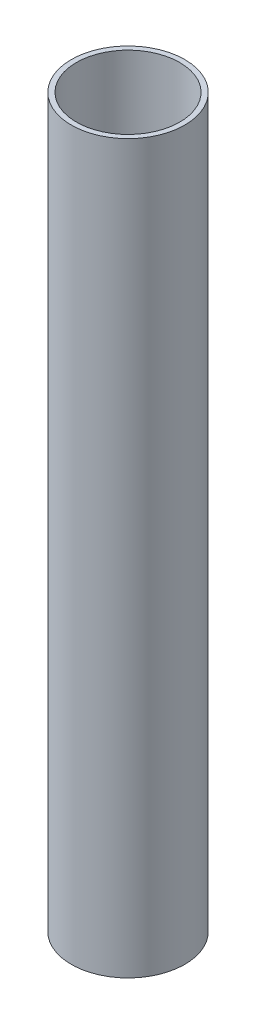
ISO-10303-21;
HEADER;
FILE_DESCRIPTION(('STEP AP214'),'2;1');
FILE_NAME('part.step','',(''),(''),'','','');
FILE_SCHEMA(('AUTOMOTIVE_DESIGN { 1 0 10303 214 1 1 1 1 }'));
ENDSEC;
DATA;
#1=APPLICATION_CONTEXT('core data for automotive mechanical design processes');
#2=APPLICATION_PROTOCOL_DEFINITION('international standard','automotive_design',2000,#1);
#3=PRODUCT_CONTEXT('',#1,'mechanical');
#4=PRODUCT('Part','Part','',(#3));
#5=PRODUCT_RELATED_PRODUCT_CATEGORY('part','',(#4));
#6=PRODUCT_DEFINITION_FORMATION('','',#4);
#7=PRODUCT_DEFINITION_CONTEXT('part definition',#1,'design');
#8=PRODUCT_DEFINITION('design','',#6,#7);
#9=PRODUCT_DEFINITION_SHAPE('','',#8);
#10=(LENGTH_UNIT() NAMED_UNIT(*) SI_UNIT(.MILLI.,.METRE.));
#11=(NAMED_UNIT(*) PLANE_ANGLE_UNIT() SI_UNIT($,.RADIAN.));
#12=(NAMED_UNIT(*) SI_UNIT($,.STERADIAN.) SOLID_ANGLE_UNIT());
#13=UNCERTAINTY_MEASURE_WITH_UNIT(LENGTH_MEASURE(1.E-05),#10,'distance_accuracy_value','');
#14=(GEOMETRIC_REPRESENTATION_CONTEXT(3) GLOBAL_UNCERTAINTY_ASSIGNED_CONTEXT((#13)) GLOBAL_UNIT_ASSIGNED_CONTEXT((#10,
#11,#12)) REPRESENTATION_CONTEXT('',''));
#15=CARTESIAN_POINT('',(0.,0.,0.));
#16=DIRECTION('',(0.,0.,1.));
#17=DIRECTION('',(1.,0.,0.));
#18=AXIS2_PLACEMENT_3D('',#15,#16,#17);
#19=CARTESIAN_POINT('',(0.,101.6,0.));
#20=DIRECTION('',(0.,-1.,0.));
#21=DIRECTION('',(0.,0.,-1.));
#22=AXIS2_PLACEMENT_3D('',#19,#20,#21);
#23=CYLINDRICAL_SURFACE('',#22,7.93369);
#24=CARTESIAN_POINT('',(0.,101.6,0.));
#25=DIRECTION('',(0.,-1.,0.));
#26=DIRECTION('',(0.,0.,-1.));
#27=AXIS2_PLACEMENT_3D('',#24,#25,#26);
#28=CIRCLE('',#27,7.93369);
#29=CARTESIAN_POINT('',(0.,101.6,-7.93369));
#30=VERTEX_POINT('',#29);
#31=EDGE_CURVE('E10',#30,#30,#28,.T.);
#32=ORIENTED_EDGE('',*,*,#31,.T.);
#33=EDGE_LOOP('',(#32));
#34=FACE_BOUND('',#33,.T.);
#35=CARTESIAN_POINT('',(0.,0.,0.));
#36=DIRECTION('',(0.,-1.,0.));
#37=DIRECTION('',(0.,0.,-1.));
#38=AXIS2_PLACEMENT_3D('',#35,#36,#37);
#39=CIRCLE('',#38,7.93369);
#40=CARTESIAN_POINT('',(0.,0.,-7.93369));
#41=VERTEX_POINT('',#40);
#42=EDGE_CURVE('E47',#41,#41,#39,.T.);
#43=ORIENTED_EDGE('',*,*,#42,.F.);
#44=EDGE_LOOP('',(#43));
#45=FACE_BOUND('',#44,.T.);
#46=ADVANCED_FACE('F33',(#34,#45),#23,.T.);
#47=CARTESIAN_POINT('',(7.93369,101.6,0.));
#48=DIRECTION('',(0.,1.,0.));
#49=DIRECTION('',(0.,0.,1.));
#50=AXIS2_PLACEMENT_3D('',#47,#48,#49);
#51=PLANE('',#50);
#52=CARTESIAN_POINT('',(0.,101.6,0.));
#53=DIRECTION('',(0.,-1.,0.));
#54=DIRECTION('',(0.,0.,-1.));
#55=AXIS2_PLACEMENT_3D('',#52,#53,#54);
#56=CIRCLE('',#55,7.22249);
#57=CARTESIAN_POINT('',(0.,101.6,-7.22249));
#58=VERTEX_POINT('',#57);
#59=EDGE_CURVE('E39',#58,#58,#56,.T.);
#60=ORIENTED_EDGE('',*,*,#59,.T.);
#61=EDGE_LOOP('',(#60));
#62=FACE_BOUND('',#61,.T.);
#63=ORIENTED_EDGE('',*,*,#31,.F.);
#64=EDGE_LOOP('',(#63));
#65=FACE_BOUND('',#64,.T.);
#66=ADVANCED_FACE('F57',(#62,#65),#51,.T.);
#67=CARTESIAN_POINT('',(0.,101.6,0.));
#68=DIRECTION('',(0.,-1.,0.));
#69=DIRECTION('',(0.,0.,-1.));
#70=AXIS2_PLACEMENT_3D('',#67,#68,#69);
#71=CYLINDRICAL_SURFACE('',#70,7.22249);
#72=CARTESIAN_POINT('',(0.,0.,0.));
#73=DIRECTION('',(0.,-1.,0.));
#74=DIRECTION('',(0.,0.,-1.));
#75=AXIS2_PLACEMENT_3D('',#72,#73,#74);
#76=CIRCLE('',#75,7.22249);
#77=CARTESIAN_POINT('',(0.,0.,-7.22249));
#78=VERTEX_POINT('',#77);
#79=EDGE_CURVE('E43',#78,#78,#76,.T.);
#80=ORIENTED_EDGE('',*,*,#79,.T.);
#81=EDGE_LOOP('',(#80));
#82=FACE_BOUND('',#81,.T.);
#83=ORIENTED_EDGE('',*,*,#59,.F.);
#84=EDGE_LOOP('',(#83));
#85=FACE_BOUND('',#84,.T.);
#86=ADVANCED_FACE('F61',(#82,#85),#71,.F.);
#87=CARTESIAN_POINT('',(7.22249,0.,0.));
#88=DIRECTION('',(0.,-1.,0.));
#89=DIRECTION('',(0.,0.,-1.));
#90=AXIS2_PLACEMENT_3D('',#87,#88,#89);
#91=PLANE('',#90);
#92=ORIENTED_EDGE('',*,*,#42,.T.);
#93=EDGE_LOOP('',(#92));
#94=FACE_BOUND('',#93,.T.);
#95=ORIENTED_EDGE('',*,*,#79,.F.);
#96=EDGE_LOOP('',(#95));
#97=FACE_BOUND('',#96,.T.);
#98=ADVANCED_FACE('F53',(#94,#97),#91,.T.);
#99=CLOSED_SHELL('',(#46,#66,#86,#98));
#100=MANIFOLD_SOLID_BREP('B2',#99);
#101=ADVANCED_BREP_SHAPE_REPRESENTATION('',(#18,#100),#14);
#102=SHAPE_DEFINITION_REPRESENTATION(#9,#101);
ENDSEC;
END-ISO-10303-21;
